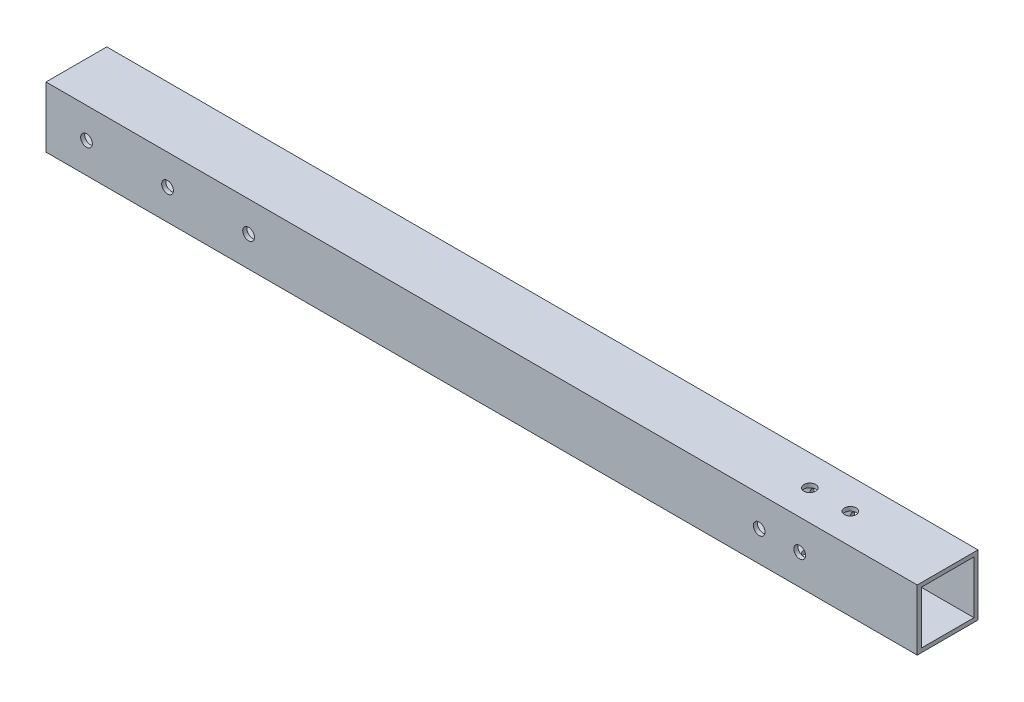
ISO-10303-21;
HEADER;
FILE_DESCRIPTION(('STEP AP214'),'2;1');
FILE_NAME('part.step','',(''),(''),'','','');
FILE_SCHEMA(('AUTOMOTIVE_DESIGN { 1 0 10303 214 1 1 1 1 }'));
ENDSEC;
DATA;
#1=APPLICATION_CONTEXT('core data for automotive mechanical design processes');
#2=APPLICATION_PROTOCOL_DEFINITION('international standard','automotive_design',2000,#1);
#3=PRODUCT_CONTEXT('',#1,'mechanical');
#4=PRODUCT('Part','Part','',(#3));
#5=PRODUCT_RELATED_PRODUCT_CATEGORY('part','',(#4));
#6=PRODUCT_DEFINITION_FORMATION('','',#4);
#7=PRODUCT_DEFINITION_CONTEXT('part definition',#1,'design');
#8=PRODUCT_DEFINITION('design','',#6,#7);
#9=PRODUCT_DEFINITION_SHAPE('','',#8);
#10=(LENGTH_UNIT() NAMED_UNIT(*) SI_UNIT(.MILLI.,.METRE.));
#11=(NAMED_UNIT(*) PLANE_ANGLE_UNIT() SI_UNIT($,.RADIAN.));
#12=(NAMED_UNIT(*) SI_UNIT($,.STERADIAN.) SOLID_ANGLE_UNIT());
#13=UNCERTAINTY_MEASURE_WITH_UNIT(LENGTH_MEASURE(1.E-05),#10,'distance_accuracy_value','');
#14=(GEOMETRIC_REPRESENTATION_CONTEXT(3) GLOBAL_UNCERTAINTY_ASSIGNED_CONTEXT((#13)) GLOBAL_UNIT_ASSIGNED_CONTEXT((#10,
#11,#12)) REPRESENTATION_CONTEXT('',''));
#15=CARTESIAN_POINT('',(0.,0.,0.));
#16=DIRECTION('',(0.,0.,1.));
#17=DIRECTION('',(1.,0.,0.));
#18=AXIS2_PLACEMENT_3D('',#15,#16,#17);
#19=CARTESIAN_POINT('',(215.,0.,0.));
#20=DIRECTION('',(-1.,0.,0.));
#21=DIRECTION('',(0.,0.,1.));
#22=AXIS2_PLACEMENT_3D('',#19,#20,#21);
#23=PLANE('',#22);
#24=DIRECTION('',(0.,1.,0.));
#25=VECTOR('',#24,1.);
#26=CARTESIAN_POINT('',(215.,-7.5,-7.5));
#27=LINE('',#26,#25);
#28=CARTESIAN_POINT('',(215.,-7.5,-7.5));
#29=VERTEX_POINT('',#28);
#30=CARTESIAN_POINT('',(215.,7.5,-7.5));
#31=VERTEX_POINT('',#30);
#32=EDGE_CURVE('E146',#29,#31,#27,.T.);
#33=ORIENTED_EDGE('',*,*,#32,.T.);
#34=DIRECTION('',(0.,0.,1.));
#35=VECTOR('',#34,1.);
#36=CARTESIAN_POINT('',(215.,7.5,7.5));
#37=LINE('',#36,#35);
#38=CARTESIAN_POINT('',(215.,7.5,7.5));
#39=VERTEX_POINT('',#38);
#40=EDGE_CURVE('E149',#31,#39,#37,.T.);
#41=ORIENTED_EDGE('',*,*,#40,.T.);
#42=DIRECTION('',(0.,-1.,0.));
#43=VECTOR('',#42,1.);
#44=CARTESIAN_POINT('',(215.,-7.5,7.5));
#45=LINE('',#44,#43);
#46=CARTESIAN_POINT('',(215.,-7.5,7.5));
#47=VERTEX_POINT('',#46);
#48=EDGE_CURVE('E152',#39,#47,#45,.T.);
#49=ORIENTED_EDGE('',*,*,#48,.T.);
#50=DIRECTION('',(0.,0.,-1.));
#51=VECTOR('',#50,1.);
#52=CARTESIAN_POINT('',(215.,-7.5,7.5));
#53=LINE('',#52,#51);
#54=EDGE_CURVE('E154',#47,#29,#53,.T.);
#55=ORIENTED_EDGE('',*,*,#54,.T.);
#56=EDGE_LOOP('',(#33,#41,#49,#55));
#57=FACE_BOUND('',#56,.T.);
#58=DIRECTION('',(0.,0.,-1.));
#59=VECTOR('',#58,1.);
#60=CARTESIAN_POINT('',(215.,-6.5,6.5));
#61=LINE('',#60,#59);
#62=CARTESIAN_POINT('',(215.,-6.5,6.5));
#63=VERTEX_POINT('',#62);
#64=CARTESIAN_POINT('',(215.,-6.5,-6.5));
#65=VERTEX_POINT('',#64);
#66=EDGE_CURVE('E108',#63,#65,#61,.T.);
#67=ORIENTED_EDGE('',*,*,#66,.F.);
#68=DIRECTION('',(0.,-1.,0.));
#69=VECTOR('',#68,1.);
#70=CARTESIAN_POINT('',(215.,-6.5,6.5));
#71=LINE('',#70,#69);
#72=CARTESIAN_POINT('',(215.,6.5,6.5));
#73=VERTEX_POINT('',#72);
#74=EDGE_CURVE('E130',#73,#63,#71,.T.);
#75=ORIENTED_EDGE('',*,*,#74,.F.);
#76=DIRECTION('',(0.,0.,1.));
#77=VECTOR('',#76,1.);
#78=CARTESIAN_POINT('',(215.,6.5,6.5));
#79=LINE('',#78,#77);
#80=CARTESIAN_POINT('',(215.,6.5,-6.5));
#81=VERTEX_POINT('',#80);
#82=EDGE_CURVE('E128',#81,#73,#79,.T.);
#83=ORIENTED_EDGE('',*,*,#82,.F.);
#84=DIRECTION('',(0.,1.,0.));
#85=VECTOR('',#84,1.);
#86=CARTESIAN_POINT('',(215.,-6.5,-6.5));
#87=LINE('',#86,#85);
#88=EDGE_CURVE('E116',#65,#81,#87,.T.);
#89=ORIENTED_EDGE('',*,*,#88,.F.);
#90=EDGE_LOOP('',(#67,#75,#83,#89));
#91=FACE_BOUND('',#90,.T.);
#92=ADVANCED_FACE('F41',(#57,#91),#23,.F.);
#93=CARTESIAN_POINT('',(0.,0.,0.));
#94=DIRECTION('',(-1.,0.,0.));
#95=DIRECTION('',(0.,0.,1.));
#96=AXIS2_PLACEMENT_3D('',#93,#94,#95);
#97=PLANE('',#96);
#98=DIRECTION('',(0.,1.,0.));
#99=VECTOR('',#98,1.);
#100=CARTESIAN_POINT('',(0.,-7.5,-7.5));
#101=LINE('',#100,#99);
#102=CARTESIAN_POINT('',(0.,-7.5,-7.5));
#103=VERTEX_POINT('',#102);
#104=CARTESIAN_POINT('',(0.,7.5,-7.5));
#105=VERTEX_POINT('',#104);
#106=EDGE_CURVE('E124',#103,#105,#101,.T.);
#107=ORIENTED_EDGE('',*,*,#106,.F.);
#108=DIRECTION('',(0.,0.,-1.));
#109=VECTOR('',#108,1.);
#110=CARTESIAN_POINT('',(0.,-7.5,7.5));
#111=LINE('',#110,#109);
#112=CARTESIAN_POINT('',(0.,-7.5,7.5));
#113=VERTEX_POINT('',#112);
#114=EDGE_CURVE('E150',#113,#103,#111,.T.);
#115=ORIENTED_EDGE('',*,*,#114,.F.);
#116=DIRECTION('',(0.,-1.,0.));
#117=VECTOR('',#116,1.);
#118=CARTESIAN_POINT('',(0.,-7.5,7.5));
#119=LINE('',#118,#117);
#120=CARTESIAN_POINT('',(0.,7.5,7.5));
#121=VERTEX_POINT('',#120);
#122=EDGE_CURVE('E161',#121,#113,#119,.T.);
#123=ORIENTED_EDGE('',*,*,#122,.F.);
#124=DIRECTION('',(0.,0.,1.));
#125=VECTOR('',#124,1.);
#126=CARTESIAN_POINT('',(0.,7.5,7.5));
#127=LINE('',#126,#125);
#128=EDGE_CURVE('E159',#105,#121,#127,.T.);
#129=ORIENTED_EDGE('',*,*,#128,.F.);
#130=EDGE_LOOP('',(#107,#115,#123,#129));
#131=FACE_BOUND('',#130,.T.);
#132=DIRECTION('',(0.,-1.,0.));
#133=VECTOR('',#132,1.);
#134=CARTESIAN_POINT('',(0.,-6.5,6.5));
#135=LINE('',#134,#133);
#136=CARTESIAN_POINT('',(0.,6.5,6.5));
#137=VERTEX_POINT('',#136);
#138=CARTESIAN_POINT('',(0.,-6.5,6.5));
#139=VERTEX_POINT('',#138);
#140=EDGE_CURVE('E117',#137,#139,#135,.T.);
#141=ORIENTED_EDGE('',*,*,#140,.T.);
#142=DIRECTION('',(0.,0.,-1.));
#143=VECTOR('',#142,1.);
#144=CARTESIAN_POINT('',(0.,-6.5,6.5));
#145=LINE('',#144,#143);
#146=CARTESIAN_POINT('',(0.,-6.5,-6.5));
#147=VERTEX_POINT('',#146);
#148=EDGE_CURVE('E66',#139,#147,#145,.T.);
#149=ORIENTED_EDGE('',*,*,#148,.T.);
#150=DIRECTION('',(0.,1.,0.));
#151=VECTOR('',#150,1.);
#152=CARTESIAN_POINT('',(0.,-6.5,-6.5));
#153=LINE('',#152,#151);
#154=CARTESIAN_POINT('',(0.,6.5,-6.5));
#155=VERTEX_POINT('',#154);
#156=EDGE_CURVE('E123',#147,#155,#153,.T.);
#157=ORIENTED_EDGE('',*,*,#156,.T.);
#158=DIRECTION('',(0.,0.,1.));
#159=VECTOR('',#158,1.);
#160=CARTESIAN_POINT('',(0.,6.5,6.5));
#161=LINE('',#160,#159);
#162=EDGE_CURVE('E138',#155,#137,#161,.T.);
#163=ORIENTED_EDGE('',*,*,#162,.T.);
#164=EDGE_LOOP('',(#141,#149,#157,#163));
#165=FACE_BOUND('',#164,.T.);
#166=ADVANCED_FACE('F281',(#131,#165),#97,.T.);
#167=CARTESIAN_POINT('',(215.,-7.5,-7.5));
#168=DIRECTION('',(0.,0.,1.));
#169=DIRECTION('',(1.,0.,0.));
#170=AXIS2_PLACEMENT_3D('',#167,#168,#169);
#171=PLANE('',#170);
#172=CARTESIAN_POINT('',(186.,0.,-7.5));
#173=DIRECTION('',(0.,0.,1.));
#174=DIRECTION('',(1.,0.,0.));
#175=AXIS2_PLACEMENT_3D('',#172,#173,#174);
#176=CIRCLE('',#175,1.45);
#177=CARTESIAN_POINT('',(187.45,0.,-7.5));
#178=VERTEX_POINT('',#177);
#179=EDGE_CURVE('E175',#178,#178,#176,.T.);
#180=ORIENTED_EDGE('',*,*,#179,.T.);
#181=EDGE_LOOP('',(#180));
#182=FACE_BOUND('',#181,.T.);
#183=CARTESIAN_POINT('',(176.,0.,-7.5));
#184=DIRECTION('',(0.,0.,1.));
#185=DIRECTION('',(1.,0.,0.));
#186=AXIS2_PLACEMENT_3D('',#183,#184,#185);
#187=CIRCLE('',#186,1.45);
#188=CARTESIAN_POINT('',(177.45,0.,-7.5));
#189=VERTEX_POINT('',#188);
#190=EDGE_CURVE('E224',#189,#189,#187,.T.);
#191=ORIENTED_EDGE('',*,*,#190,.T.);
#192=EDGE_LOOP('',(#191));
#193=FACE_BOUND('',#192,.T.);
#194=CARTESIAN_POINT('',(50.,0.,-7.5));
#195=DIRECTION('',(0.,0.,1.));
#196=DIRECTION('',(1.,0.,0.));
#197=AXIS2_PLACEMENT_3D('',#194,#195,#196);
#198=CIRCLE('',#197,1.45);
#199=CARTESIAN_POINT('',(51.45,0.,-7.5));
#200=VERTEX_POINT('',#199);
#201=EDGE_CURVE('E230',#200,#200,#198,.T.);
#202=ORIENTED_EDGE('',*,*,#201,.T.);
#203=EDGE_LOOP('',(#202));
#204=FACE_BOUND('',#203,.T.);
#205=CARTESIAN_POINT('',(30.,0.,-7.5));
#206=DIRECTION('',(0.,0.,1.));
#207=DIRECTION('',(1.,0.,0.));
#208=AXIS2_PLACEMENT_3D('',#205,#206,#207);
#209=CIRCLE('',#208,1.45);
#210=CARTESIAN_POINT('',(31.45,0.,-7.5));
#211=VERTEX_POINT('',#210);
#212=EDGE_CURVE('E236',#211,#211,#209,.T.);
#213=ORIENTED_EDGE('',*,*,#212,.T.);
#214=EDGE_LOOP('',(#213));
#215=FACE_BOUND('',#214,.T.);
#216=CARTESIAN_POINT('',(10.,0.,-7.5));
#217=DIRECTION('',(0.,0.,1.));
#218=DIRECTION('',(1.,0.,0.));
#219=AXIS2_PLACEMENT_3D('',#216,#217,#218);
#220=CIRCLE('',#219,1.45);
#221=CARTESIAN_POINT('',(11.45,0.,-7.5));
#222=VERTEX_POINT('',#221);
#223=EDGE_CURVE('E215',#222,#222,#220,.T.);
#224=ORIENTED_EDGE('',*,*,#223,.T.);
#225=EDGE_LOOP('',(#224));
#226=FACE_BOUND('',#225,.T.);
#227=ORIENTED_EDGE('',*,*,#106,.T.);
#228=DIRECTION('',(-1.,0.,0.));
#229=VECTOR('',#228,1.);
#230=CARTESIAN_POINT('',(215.,7.5,-7.5));
#231=LINE('',#230,#229);
#232=EDGE_CURVE('E11',#31,#105,#231,.T.);
#233=ORIENTED_EDGE('',*,*,#232,.F.);
#234=ORIENTED_EDGE('',*,*,#32,.F.);
#235=DIRECTION('',(-1.,0.,0.));
#236=VECTOR('',#235,1.);
#237=CARTESIAN_POINT('',(215.,-7.5,-7.5));
#238=LINE('',#237,#236);
#239=EDGE_CURVE('E156',#29,#103,#238,.T.);
#240=ORIENTED_EDGE('',*,*,#239,.T.);
#241=EDGE_LOOP('',(#227,#233,#234,#240));
#242=FACE_BOUND('',#241,.T.);
#243=ADVANCED_FACE('F43',(#182,#193,#204,#215,#226,#242),#171,.F.);
#244=CARTESIAN_POINT('',(215.,7.5,7.5));
#245=DIRECTION('',(0.,-1.,0.));
#246=DIRECTION('',(0.,0.,-1.));
#247=AXIS2_PLACEMENT_3D('',#244,#245,#246);
#248=PLANE('',#247);
#249=CARTESIAN_POINT('',(191.,7.5,0.));
#250=DIRECTION('',(0.,1.,0.));
#251=DIRECTION('',(0.,0.,1.));
#252=AXIS2_PLACEMENT_3D('',#249,#250,#251);
#253=CIRCLE('',#252,1.45);
#254=CARTESIAN_POINT('',(191.,7.5,1.45));
#255=VERTEX_POINT('',#254);
#256=EDGE_CURVE('E199',#255,#255,#253,.T.);
#257=ORIENTED_EDGE('',*,*,#256,.F.);
#258=EDGE_LOOP('',(#257));
#259=FACE_BOUND('',#258,.T.);
#260=CARTESIAN_POINT('',(181.,7.5,0.));
#261=DIRECTION('',(0.,1.,0.));
#262=DIRECTION('',(0.,0.,1.));
#263=AXIS2_PLACEMENT_3D('',#260,#261,#262);
#264=CIRCLE('',#263,1.45);
#265=CARTESIAN_POINT('',(181.,7.5,1.45));
#266=VERTEX_POINT('',#265);
#267=EDGE_CURVE('E204',#266,#266,#264,.T.);
#268=ORIENTED_EDGE('',*,*,#267,.F.);
#269=EDGE_LOOP('',(#268));
#270=FACE_BOUND('',#269,.T.);
#271=ORIENTED_EDGE('',*,*,#128,.T.);
#272=DIRECTION('',(-1.,0.,0.));
#273=VECTOR('',#272,1.);
#274=CARTESIAN_POINT('',(215.,7.5,7.5));
#275=LINE('',#274,#273);
#276=EDGE_CURVE('E50',#39,#121,#275,.T.);
#277=ORIENTED_EDGE('',*,*,#276,.F.);
#278=ORIENTED_EDGE('',*,*,#40,.F.);
#279=ORIENTED_EDGE('',*,*,#232,.T.);
#280=EDGE_LOOP('',(#271,#277,#278,#279));
#281=FACE_BOUND('',#280,.T.);
#282=ADVANCED_FACE('F280',(#259,#270,#281),#248,.F.);
#283=CARTESIAN_POINT('',(215.,-7.5,7.5));
#284=DIRECTION('',(0.,0.,-1.));
#285=DIRECTION('',(-1.,0.,0.));
#286=AXIS2_PLACEMENT_3D('',#283,#284,#285);
#287=PLANE('',#286);
#288=CARTESIAN_POINT('',(186.,0.,7.5));
#289=DIRECTION('',(0.,0.,1.));
#290=DIRECTION('',(1.,0.,0.));
#291=AXIS2_PLACEMENT_3D('',#288,#289,#290);
#292=CIRCLE('',#291,1.45);
#293=CARTESIAN_POINT('',(187.45,0.,7.5));
#294=VERTEX_POINT('',#293);
#295=EDGE_CURVE('E218',#294,#294,#292,.T.);
#296=ORIENTED_EDGE('',*,*,#295,.F.);
#297=EDGE_LOOP('',(#296));
#298=FACE_BOUND('',#297,.T.);
#299=CARTESIAN_POINT('',(176.,0.,7.5));
#300=DIRECTION('',(0.,0.,1.));
#301=DIRECTION('',(1.,0.,0.));
#302=AXIS2_PLACEMENT_3D('',#299,#300,#301);
#303=CIRCLE('',#302,1.45);
#304=CARTESIAN_POINT('',(177.45,0.,7.5));
#305=VERTEX_POINT('',#304);
#306=EDGE_CURVE('E221',#305,#305,#303,.T.);
#307=ORIENTED_EDGE('',*,*,#306,.F.);
#308=EDGE_LOOP('',(#307));
#309=FACE_BOUND('',#308,.T.);
#310=CARTESIAN_POINT('',(50.,0.,7.5));
#311=DIRECTION('',(0.,0.,1.));
#312=DIRECTION('',(1.,0.,0.));
#313=AXIS2_PLACEMENT_3D('',#310,#311,#312);
#314=CIRCLE('',#313,1.45);
#315=CARTESIAN_POINT('',(51.45,0.,7.5));
#316=VERTEX_POINT('',#315);
#317=EDGE_CURVE('E227',#316,#316,#314,.T.);
#318=ORIENTED_EDGE('',*,*,#317,.F.);
#319=EDGE_LOOP('',(#318));
#320=FACE_BOUND('',#319,.T.);
#321=CARTESIAN_POINT('',(30.,0.,7.5));
#322=DIRECTION('',(0.,0.,1.));
#323=DIRECTION('',(1.,0.,0.));
#324=AXIS2_PLACEMENT_3D('',#321,#322,#323);
#325=CIRCLE('',#324,1.45);
#326=CARTESIAN_POINT('',(31.45,0.,7.5));
#327=VERTEX_POINT('',#326);
#328=EDGE_CURVE('E233',#327,#327,#325,.T.);
#329=ORIENTED_EDGE('',*,*,#328,.F.);
#330=EDGE_LOOP('',(#329));
#331=FACE_BOUND('',#330,.T.);
#332=CARTESIAN_POINT('',(10.,0.,7.5));
#333=DIRECTION('',(0.,0.,1.));
#334=DIRECTION('',(1.,0.,0.));
#335=AXIS2_PLACEMENT_3D('',#332,#333,#334);
#336=CIRCLE('',#335,1.45);
#337=CARTESIAN_POINT('',(11.45,0.,7.5));
#338=VERTEX_POINT('',#337);
#339=EDGE_CURVE('E239',#338,#338,#336,.T.);
#340=ORIENTED_EDGE('',*,*,#339,.F.);
#341=EDGE_LOOP('',(#340));
#342=FACE_BOUND('',#341,.T.);
#343=ORIENTED_EDGE('',*,*,#122,.T.);
#344=DIRECTION('',(-1.,0.,0.));
#345=VECTOR('',#344,1.);
#346=CARTESIAN_POINT('',(215.,-7.5,7.5));
#347=LINE('',#346,#345);
#348=EDGE_CURVE('E166',#47,#113,#347,.T.);
#349=ORIENTED_EDGE('',*,*,#348,.F.);
#350=ORIENTED_EDGE('',*,*,#48,.F.);
#351=ORIENTED_EDGE('',*,*,#276,.T.);
#352=EDGE_LOOP('',(#343,#349,#350,#351));
#353=FACE_BOUND('',#352,.T.);
#354=ADVANCED_FACE('F300',(#298,#309,#320,#331,#342,#353),#287,.F.);
#355=CARTESIAN_POINT('',(215.,-7.5,7.5));
#356=DIRECTION('',(0.,1.,0.));
#357=DIRECTION('',(0.,0.,1.));
#358=AXIS2_PLACEMENT_3D('',#355,#356,#357);
#359=PLANE('',#358);
#360=CARTESIAN_POINT('',(191.,-7.5,0.));
#361=DIRECTION('',(0.,1.,0.));
#362=DIRECTION('',(0.,0.,1.));
#363=AXIS2_PLACEMENT_3D('',#360,#361,#362);
#364=CIRCLE('',#363,1.45);
#365=CARTESIAN_POINT('',(191.,-7.5,1.45));
#366=VERTEX_POINT('',#365);
#367=EDGE_CURVE('E193',#366,#366,#364,.T.);
#368=ORIENTED_EDGE('',*,*,#367,.T.);
#369=EDGE_LOOP('',(#368));
#370=FACE_BOUND('',#369,.T.);
#371=CARTESIAN_POINT('',(181.,-7.5,0.));
#372=DIRECTION('',(0.,1.,0.));
#373=DIRECTION('',(0.,0.,1.));
#374=AXIS2_PLACEMENT_3D('',#371,#372,#373);
#375=CIRCLE('',#374,1.45);
#376=CARTESIAN_POINT('',(181.,-7.5,1.45));
#377=VERTEX_POINT('',#376);
#378=EDGE_CURVE('E209',#377,#377,#375,.T.);
#379=ORIENTED_EDGE('',*,*,#378,.T.);
#380=EDGE_LOOP('',(#379));
#381=FACE_BOUND('',#380,.T.);
#382=ORIENTED_EDGE('',*,*,#114,.T.);
#383=ORIENTED_EDGE('',*,*,#239,.F.);
#384=ORIENTED_EDGE('',*,*,#54,.F.);
#385=ORIENTED_EDGE('',*,*,#348,.T.);
#386=EDGE_LOOP('',(#382,#383,#384,#385));
#387=FACE_BOUND('',#386,.T.);
#388=ADVANCED_FACE('F298',(#370,#381,#387),#359,.F.);
#389=CARTESIAN_POINT('',(215.,-6.5,6.5));
#390=DIRECTION('',(0.,1.,0.));
#391=DIRECTION('',(0.,0.,1.));
#392=AXIS2_PLACEMENT_3D('',#389,#390,#391);
#393=PLANE('',#392);
#394=CARTESIAN_POINT('',(191.,-6.5,0.));
#395=DIRECTION('',(0.,1.,0.));
#396=DIRECTION('',(0.,0.,1.));
#397=AXIS2_PLACEMENT_3D('',#394,#395,#396);
#398=CIRCLE('',#397,1.45);
#399=CARTESIAN_POINT('',(191.,-6.5,1.45));
#400=VERTEX_POINT('',#399);
#401=EDGE_CURVE('E212',#400,#400,#398,.T.);
#402=ORIENTED_EDGE('',*,*,#401,.F.);
#403=EDGE_LOOP('',(#402));
#404=FACE_BOUND('',#403,.T.);
#405=CARTESIAN_POINT('',(181.,-6.5,0.));
#406=DIRECTION('',(0.,1.,0.));
#407=DIRECTION('',(0.,0.,1.));
#408=AXIS2_PLACEMENT_3D('',#405,#406,#407);
#409=CIRCLE('',#408,1.45);
#410=CARTESIAN_POINT('',(181.,-6.5,1.45));
#411=VERTEX_POINT('',#410);
#412=EDGE_CURVE('E192',#411,#411,#409,.T.);
#413=ORIENTED_EDGE('',*,*,#412,.F.);
#414=EDGE_LOOP('',(#413));
#415=FACE_BOUND('',#414,.T.);
#416=ORIENTED_EDGE('',*,*,#148,.F.);
#417=DIRECTION('',(-1.,0.,0.));
#418=VECTOR('',#417,1.);
#419=CARTESIAN_POINT('',(215.,-6.5,6.5));
#420=LINE('',#419,#418);
#421=EDGE_CURVE('E112',#63,#139,#420,.T.);
#422=ORIENTED_EDGE('',*,*,#421,.F.);
#423=ORIENTED_EDGE('',*,*,#66,.T.);
#424=DIRECTION('',(-1.,0.,0.));
#425=VECTOR('',#424,1.);
#426=CARTESIAN_POINT('',(215.,-6.5,-6.5));
#427=LINE('',#426,#425);
#428=EDGE_CURVE('E111',#65,#147,#427,.T.);
#429=ORIENTED_EDGE('',*,*,#428,.T.);
#430=EDGE_LOOP('',(#416,#422,#423,#429));
#431=FACE_BOUND('',#430,.T.);
#432=ADVANCED_FACE('F110',(#404,#415,#431),#393,.T.);
#433=CARTESIAN_POINT('',(215.,-6.5,-6.5));
#434=DIRECTION('',(0.,0.,1.));
#435=DIRECTION('',(0.,-1.,0.));
#436=AXIS2_PLACEMENT_3D('',#433,#434,#435);
#437=PLANE('',#436);
#438=CARTESIAN_POINT('',(186.,0.,-6.5));
#439=DIRECTION('',(0.,0.,1.));
#440=DIRECTION('',(0.,-1.,0.));
#441=AXIS2_PLACEMENT_3D('',#438,#439,#440);
#442=CIRCLE('',#441,1.45);
#443=CARTESIAN_POINT('',(186.,-1.45,-6.5));
#444=VERTEX_POINT('',#443);
#445=EDGE_CURVE('E136',#444,#444,#442,.T.);
#446=ORIENTED_EDGE('',*,*,#445,.F.);
#447=EDGE_LOOP('',(#446));
#448=FACE_BOUND('',#447,.T.);
#449=CARTESIAN_POINT('',(176.,0.,-6.5));
#450=DIRECTION('',(0.,0.,1.));
#451=DIRECTION('',(0.,-1.,0.));
#452=AXIS2_PLACEMENT_3D('',#449,#450,#451);
#453=CIRCLE('',#452,1.45);
#454=CARTESIAN_POINT('',(176.,-1.45,-6.5));
#455=VERTEX_POINT('',#454);
#456=EDGE_CURVE('E187',#455,#455,#453,.T.);
#457=ORIENTED_EDGE('',*,*,#456,.F.);
#458=EDGE_LOOP('',(#457));
#459=FACE_BOUND('',#458,.T.);
#460=CARTESIAN_POINT('',(50.,0.,-6.5));
#461=DIRECTION('',(0.,0.,1.));
#462=DIRECTION('',(0.,-1.,0.));
#463=AXIS2_PLACEMENT_3D('',#460,#461,#462);
#464=CIRCLE('',#463,1.45);
#465=CARTESIAN_POINT('',(50.,-1.45000000000001,-6.5));
#466=VERTEX_POINT('',#465);
#467=EDGE_CURVE('E183',#466,#466,#464,.T.);
#468=ORIENTED_EDGE('',*,*,#467,.F.);
#469=EDGE_LOOP('',(#468));
#470=FACE_BOUND('',#469,.T.);
#471=CARTESIAN_POINT('',(30.,0.,-6.5));
#472=DIRECTION('',(0.,0.,1.));
#473=DIRECTION('',(0.,-1.,0.));
#474=AXIS2_PLACEMENT_3D('',#471,#472,#473);
#475=CIRCLE('',#474,1.45);
#476=CARTESIAN_POINT('',(30.,-1.45000000000001,-6.5));
#477=VERTEX_POINT('',#476);
#478=EDGE_CURVE('E179',#477,#477,#475,.T.);
#479=ORIENTED_EDGE('',*,*,#478,.F.);
#480=EDGE_LOOP('',(#479));
#481=FACE_BOUND('',#480,.T.);
#482=CARTESIAN_POINT('',(10.,0.,-6.5));
#483=DIRECTION('',(0.,0.,1.));
#484=DIRECTION('',(0.,-1.,0.));
#485=AXIS2_PLACEMENT_3D('',#482,#483,#484);
#486=CIRCLE('',#485,1.45);
#487=CARTESIAN_POINT('',(10.,-1.45000000000001,-6.5));
#488=VERTEX_POINT('',#487);
#489=EDGE_CURVE('E174',#488,#488,#486,.T.);
#490=ORIENTED_EDGE('',*,*,#489,.F.);
#491=EDGE_LOOP('',(#490));
#492=FACE_BOUND('',#491,.T.);
#493=ORIENTED_EDGE('',*,*,#156,.F.);
#494=ORIENTED_EDGE('',*,*,#428,.F.);
#495=ORIENTED_EDGE('',*,*,#88,.T.);
#496=DIRECTION('',(-1.,0.,0.));
#497=VECTOR('',#496,1.);
#498=CARTESIAN_POINT('',(215.,6.5,-6.5));
#499=LINE('',#498,#497);
#500=EDGE_CURVE('E125',#81,#155,#499,.T.);
#501=ORIENTED_EDGE('',*,*,#500,.T.);
#502=EDGE_LOOP('',(#493,#494,#495,#501));
#503=FACE_BOUND('',#502,.T.);
#504=ADVANCED_FACE('F120',(#448,#459,#470,#481,#492,#503),#437,.T.);
#505=CARTESIAN_POINT('',(215.,6.5,6.5));
#506=DIRECTION('',(0.,-1.,0.));
#507=DIRECTION('',(0.,0.,-1.));
#508=AXIS2_PLACEMENT_3D('',#505,#506,#507);
#509=PLANE('',#508);
#510=CARTESIAN_POINT('',(191.,6.5,0.));
#511=DIRECTION('',(0.,-1.,0.));
#512=DIRECTION('',(0.,0.,-1.));
#513=AXIS2_PLACEMENT_3D('',#510,#511,#512);
#514=CIRCLE('',#513,1.45);
#515=CARTESIAN_POINT('',(191.,6.5,-1.45));
#516=VERTEX_POINT('',#515);
#517=EDGE_CURVE('E45',#516,#516,#514,.T.);
#518=ORIENTED_EDGE('',*,*,#517,.F.);
#519=EDGE_LOOP('',(#518));
#520=FACE_BOUND('',#519,.T.);
#521=CARTESIAN_POINT('',(181.,6.5,0.));
#522=DIRECTION('',(0.,-1.,0.));
#523=DIRECTION('',(0.,0.,-1.));
#524=AXIS2_PLACEMENT_3D('',#521,#522,#523);
#525=CIRCLE('',#524,1.45);
#526=CARTESIAN_POINT('',(181.,6.5,-1.45));
#527=VERTEX_POINT('',#526);
#528=EDGE_CURVE('E190',#527,#527,#525,.T.);
#529=ORIENTED_EDGE('',*,*,#528,.F.);
#530=EDGE_LOOP('',(#529));
#531=FACE_BOUND('',#530,.T.);
#532=ORIENTED_EDGE('',*,*,#162,.F.);
#533=ORIENTED_EDGE('',*,*,#500,.F.);
#534=ORIENTED_EDGE('',*,*,#82,.T.);
#535=DIRECTION('',(-1.,0.,0.));
#536=VECTOR('',#535,1.);
#537=CARTESIAN_POINT('',(215.,6.5,6.5));
#538=LINE('',#537,#536);
#539=EDGE_CURVE('E58',#73,#137,#538,.T.);
#540=ORIENTED_EDGE('',*,*,#539,.T.);
#541=EDGE_LOOP('',(#532,#533,#534,#540));
#542=FACE_BOUND('',#541,.T.);
#543=ADVANCED_FACE('F259',(#520,#531,#542),#509,.T.);
#544=CARTESIAN_POINT('',(215.,-6.5,6.5));
#545=DIRECTION('',(0.,0.,-1.));
#546=DIRECTION('',(-1.,0.,0.));
#547=AXIS2_PLACEMENT_3D('',#544,#545,#546);
#548=PLANE('',#547);
#549=CARTESIAN_POINT('',(186.,0.,6.5));
#550=DIRECTION('',(0.,0.,-1.));
#551=DIRECTION('',(-1.,0.,0.));
#552=AXIS2_PLACEMENT_3D('',#549,#550,#551);
#553=CIRCLE('',#552,1.45);
#554=CARTESIAN_POINT('',(184.55,0.,6.5));
#555=VERTEX_POINT('',#554);
#556=EDGE_CURVE('E188',#555,#555,#553,.T.);
#557=ORIENTED_EDGE('',*,*,#556,.F.);
#558=EDGE_LOOP('',(#557));
#559=FACE_BOUND('',#558,.T.);
#560=CARTESIAN_POINT('',(176.,0.,6.5));
#561=DIRECTION('',(0.,0.,-1.));
#562=DIRECTION('',(-1.,0.,0.));
#563=AXIS2_PLACEMENT_3D('',#560,#561,#562);
#564=CIRCLE('',#563,1.45);
#565=CARTESIAN_POINT('',(174.55,0.,6.5));
#566=VERTEX_POINT('',#565);
#567=EDGE_CURVE('E184',#566,#566,#564,.T.);
#568=ORIENTED_EDGE('',*,*,#567,.F.);
#569=EDGE_LOOP('',(#568));
#570=FACE_BOUND('',#569,.T.);
#571=CARTESIAN_POINT('',(50.,0.,6.5));
#572=DIRECTION('',(0.,0.,-1.));
#573=DIRECTION('',(-1.,0.,0.));
#574=AXIS2_PLACEMENT_3D('',#571,#572,#573);
#575=CIRCLE('',#574,1.45);
#576=CARTESIAN_POINT('',(48.55,0.,6.5));
#577=VERTEX_POINT('',#576);
#578=EDGE_CURVE('E180',#577,#577,#575,.T.);
#579=ORIENTED_EDGE('',*,*,#578,.F.);
#580=EDGE_LOOP('',(#579));
#581=FACE_BOUND('',#580,.T.);
#582=CARTESIAN_POINT('',(30.,0.,6.5));
#583=DIRECTION('',(0.,0.,-1.));
#584=DIRECTION('',(-1.,0.,0.));
#585=AXIS2_PLACEMENT_3D('',#582,#583,#584);
#586=CIRCLE('',#585,1.45);
#587=CARTESIAN_POINT('',(28.55,0.,6.5));
#588=VERTEX_POINT('',#587);
#589=EDGE_CURVE('E176',#588,#588,#586,.T.);
#590=ORIENTED_EDGE('',*,*,#589,.F.);
#591=EDGE_LOOP('',(#590));
#592=FACE_BOUND('',#591,.T.);
#593=CARTESIAN_POINT('',(10.,0.,6.5));
#594=DIRECTION('',(0.,0.,-1.));
#595=DIRECTION('',(-1.,0.,0.));
#596=AXIS2_PLACEMENT_3D('',#593,#594,#595);
#597=CIRCLE('',#596,1.45);
#598=CARTESIAN_POINT('',(8.55000000000003,0.,6.5));
#599=VERTEX_POINT('',#598);
#600=EDGE_CURVE('E171',#599,#599,#597,.T.);
#601=ORIENTED_EDGE('',*,*,#600,.F.);
#602=EDGE_LOOP('',(#601));
#603=FACE_BOUND('',#602,.T.);
#604=ORIENTED_EDGE('',*,*,#140,.F.);
#605=ORIENTED_EDGE('',*,*,#539,.F.);
#606=ORIENTED_EDGE('',*,*,#74,.T.);
#607=ORIENTED_EDGE('',*,*,#421,.T.);
#608=EDGE_LOOP('',(#604,#605,#606,#607));
#609=FACE_BOUND('',#608,.T.);
#610=ADVANCED_FACE('F324',(#559,#570,#581,#592,#603,#609),#548,.T.);
#611=CARTESIAN_POINT('',(10.,0.,-7.5));
#612=DIRECTION('',(0.,0.,1.));
#613=DIRECTION('',(1.,0.,0.));
#614=AXIS2_PLACEMENT_3D('',#611,#612,#613);
#615=CYLINDRICAL_SURFACE('',#614,1.45);
#616=ORIENTED_EDGE('',*,*,#600,.T.);
#617=EDGE_LOOP('',(#616));
#618=FACE_BOUND('',#617,.T.);
#619=ORIENTED_EDGE('',*,*,#339,.T.);
#620=EDGE_LOOP('',(#619));
#621=FACE_BOUND('',#620,.T.);
#622=ADVANCED_FACE('F275',(#618,#621),#615,.F.);
#623=CARTESIAN_POINT('',(30.,0.,-7.5));
#624=DIRECTION('',(0.,0.,1.));
#625=DIRECTION('',(1.,0.,0.));
#626=AXIS2_PLACEMENT_3D('',#623,#624,#625);
#627=CYLINDRICAL_SURFACE('',#626,1.45);
#628=ORIENTED_EDGE('',*,*,#589,.T.);
#629=EDGE_LOOP('',(#628));
#630=FACE_BOUND('',#629,.T.);
#631=ORIENTED_EDGE('',*,*,#328,.T.);
#632=EDGE_LOOP('',(#631));
#633=FACE_BOUND('',#632,.T.);
#634=ADVANCED_FACE('F330',(#630,#633),#627,.F.);
#635=CARTESIAN_POINT('',(50.,0.,-7.5));
#636=DIRECTION('',(0.,0.,1.));
#637=DIRECTION('',(1.,0.,0.));
#638=AXIS2_PLACEMENT_3D('',#635,#636,#637);
#639=CYLINDRICAL_SURFACE('',#638,1.45);
#640=ORIENTED_EDGE('',*,*,#578,.T.);
#641=EDGE_LOOP('',(#640));
#642=FACE_BOUND('',#641,.T.);
#643=ORIENTED_EDGE('',*,*,#317,.T.);
#644=EDGE_LOOP('',(#643));
#645=FACE_BOUND('',#644,.T.);
#646=ADVANCED_FACE('F334',(#642,#645),#639,.F.);
#647=CARTESIAN_POINT('',(176.,0.,-7.5));
#648=DIRECTION('',(0.,0.,1.));
#649=DIRECTION('',(1.,0.,0.));
#650=AXIS2_PLACEMENT_3D('',#647,#648,#649);
#651=CYLINDRICAL_SURFACE('',#650,1.45);
#652=ORIENTED_EDGE('',*,*,#567,.T.);
#653=EDGE_LOOP('',(#652));
#654=FACE_BOUND('',#653,.T.);
#655=ORIENTED_EDGE('',*,*,#306,.T.);
#656=EDGE_LOOP('',(#655));
#657=FACE_BOUND('',#656,.T.);
#658=ADVANCED_FACE('F338',(#654,#657),#651,.F.);
#659=CARTESIAN_POINT('',(186.,0.,-7.5));
#660=DIRECTION('',(0.,0.,1.));
#661=DIRECTION('',(1.,0.,0.));
#662=AXIS2_PLACEMENT_3D('',#659,#660,#661);
#663=CYLINDRICAL_SURFACE('',#662,1.45);
#664=ORIENTED_EDGE('',*,*,#556,.T.);
#665=EDGE_LOOP('',(#664));
#666=FACE_BOUND('',#665,.T.);
#667=ORIENTED_EDGE('',*,*,#295,.T.);
#668=EDGE_LOOP('',(#667));
#669=FACE_BOUND('',#668,.T.);
#670=ADVANCED_FACE('F273',(#666,#669),#663,.F.);
#671=ORIENTED_EDGE('',*,*,#489,.T.);
#672=EDGE_LOOP('',(#671));
#673=FACE_BOUND('',#672,.T.);
#674=ORIENTED_EDGE('',*,*,#223,.F.);
#675=EDGE_LOOP('',(#674));
#676=FACE_BOUND('',#675,.T.);
#677=ADVANCED_FACE('F269',(#673,#676),#615,.F.);
#678=ORIENTED_EDGE('',*,*,#478,.T.);
#679=EDGE_LOOP('',(#678));
#680=FACE_BOUND('',#679,.T.);
#681=ORIENTED_EDGE('',*,*,#212,.F.);
#682=EDGE_LOOP('',(#681));
#683=FACE_BOUND('',#682,.T.);
#684=ADVANCED_FACE('F272',(#680,#683),#627,.F.);
#685=ORIENTED_EDGE('',*,*,#467,.T.);
#686=EDGE_LOOP('',(#685));
#687=FACE_BOUND('',#686,.T.);
#688=ORIENTED_EDGE('',*,*,#201,.F.);
#689=EDGE_LOOP('',(#688));
#690=FACE_BOUND('',#689,.T.);
#691=ADVANCED_FACE('F340',(#687,#690),#639,.F.);
#692=ORIENTED_EDGE('',*,*,#456,.T.);
#693=EDGE_LOOP('',(#692));
#694=FACE_BOUND('',#693,.T.);
#695=ORIENTED_EDGE('',*,*,#190,.F.);
#696=EDGE_LOOP('',(#695));
#697=FACE_BOUND('',#696,.T.);
#698=ADVANCED_FACE('F344',(#694,#697),#651,.F.);
#699=ORIENTED_EDGE('',*,*,#445,.T.);
#700=EDGE_LOOP('',(#699));
#701=FACE_BOUND('',#700,.T.);
#702=ORIENTED_EDGE('',*,*,#179,.F.);
#703=EDGE_LOOP('',(#702));
#704=FACE_BOUND('',#703,.T.);
#705=ADVANCED_FACE('F254',(#701,#704),#663,.F.);
#706=CARTESIAN_POINT('',(181.,-7.5,0.));
#707=DIRECTION('',(0.,1.,0.));
#708=DIRECTION('',(0.,0.,1.));
#709=AXIS2_PLACEMENT_3D('',#706,#707,#708);
#710=CYLINDRICAL_SURFACE('',#709,1.45);
#711=ORIENTED_EDGE('',*,*,#528,.T.);
#712=EDGE_LOOP('',(#711));
#713=FACE_BOUND('',#712,.T.);
#714=ORIENTED_EDGE('',*,*,#267,.T.);
#715=EDGE_LOOP('',(#714));
#716=FACE_BOUND('',#715,.T.);
#717=ADVANCED_FACE('F348',(#713,#716),#710,.F.);
#718=CARTESIAN_POINT('',(191.,-7.5,0.));
#719=DIRECTION('',(0.,1.,0.));
#720=DIRECTION('',(0.,0.,1.));
#721=AXIS2_PLACEMENT_3D('',#718,#719,#720);
#722=CYLINDRICAL_SURFACE('',#721,1.45);
#723=ORIENTED_EDGE('',*,*,#517,.T.);
#724=EDGE_LOOP('',(#723));
#725=FACE_BOUND('',#724,.T.);
#726=ORIENTED_EDGE('',*,*,#256,.T.);
#727=EDGE_LOOP('',(#726));
#728=FACE_BOUND('',#727,.T.);
#729=ADVANCED_FACE('F351',(#725,#728),#722,.F.);
#730=ORIENTED_EDGE('',*,*,#412,.T.);
#731=EDGE_LOOP('',(#730));
#732=FACE_BOUND('',#731,.T.);
#733=ORIENTED_EDGE('',*,*,#378,.F.);
#734=EDGE_LOOP('',(#733));
#735=FACE_BOUND('',#734,.T.);
#736=ADVANCED_FACE('F352',(#732,#735),#710,.F.);
#737=ORIENTED_EDGE('',*,*,#401,.T.);
#738=EDGE_LOOP('',(#737));
#739=FACE_BOUND('',#738,.T.);
#740=ORIENTED_EDGE('',*,*,#367,.F.);
#741=EDGE_LOOP('',(#740));
#742=FACE_BOUND('',#741,.T.);
#743=ADVANCED_FACE('F355',(#739,#742),#722,.F.);
#744=CLOSED_SHELL('',(#92,#166,#243,#282,#354,#388,#432,#504,#543,#610,#622,#634,#646,#658,#670,
#677,#684,#691,#698,#705,#717,#729,#736,#743));
#745=MANIFOLD_SOLID_BREP('B2',#744);
#746=ADVANCED_BREP_SHAPE_REPRESENTATION('',(#18,#745),#14);
#747=SHAPE_DEFINITION_REPRESENTATION(#9,#746);
ENDSEC;
END-ISO-10303-21;
